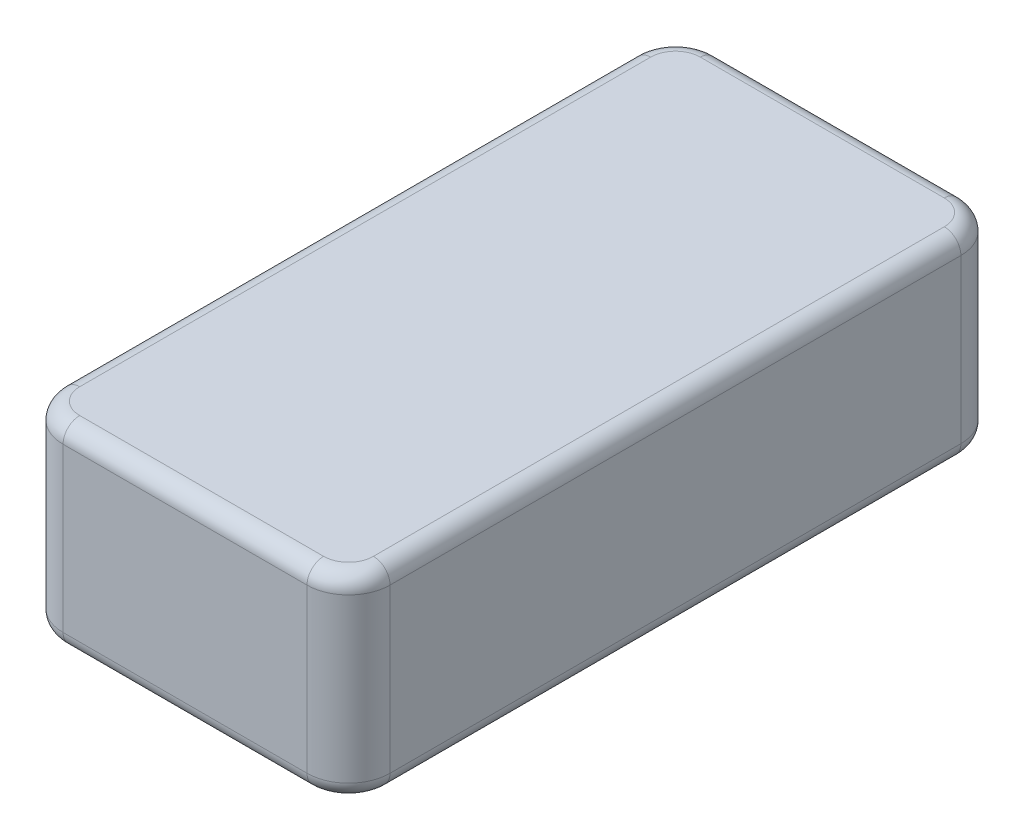
ISO-10303-21;
HEADER;
FILE_DESCRIPTION(('STEP AP214'),'2;1');
FILE_NAME('part.step','',(''),(''),'','','');
FILE_SCHEMA(('AUTOMOTIVE_DESIGN { 1 0 10303 214 1 1 1 1 }'));
ENDSEC;
DATA;
#1=APPLICATION_CONTEXT('core data for automotive mechanical design processes');
#2=APPLICATION_PROTOCOL_DEFINITION('international standard','automotive_design',2000,#1);
#3=PRODUCT_CONTEXT('',#1,'mechanical');
#4=PRODUCT('Part','Part','',(#3));
#5=PRODUCT_RELATED_PRODUCT_CATEGORY('part','',(#4));
#6=PRODUCT_DEFINITION_FORMATION('','',#4);
#7=PRODUCT_DEFINITION_CONTEXT('part definition',#1,'design');
#8=PRODUCT_DEFINITION('design','',#6,#7);
#9=PRODUCT_DEFINITION_SHAPE('','',#8);
#10=(LENGTH_UNIT() NAMED_UNIT(*) SI_UNIT(.MILLI.,.METRE.));
#11=(NAMED_UNIT(*) PLANE_ANGLE_UNIT() SI_UNIT($,.RADIAN.));
#12=(NAMED_UNIT(*) SI_UNIT($,.STERADIAN.) SOLID_ANGLE_UNIT());
#13=UNCERTAINTY_MEASURE_WITH_UNIT(LENGTH_MEASURE(1.E-05),#10,'distance_accuracy_value','');
#14=(GEOMETRIC_REPRESENTATION_CONTEXT(3) GLOBAL_UNCERTAINTY_ASSIGNED_CONTEXT((#13)) GLOBAL_UNIT_ASSIGNED_CONTEXT((#10,
#11,#12)) REPRESENTATION_CONTEXT('',''));
#15=CARTESIAN_POINT('',(0.,0.,0.));
#16=DIRECTION('',(0.,0.,1.));
#17=DIRECTION('',(1.,0.,0.));
#18=AXIS2_PLACEMENT_3D('',#15,#16,#17);
#19=CARTESIAN_POINT('',(0.,3.,0.));
#20=DIRECTION('',(1.,0.,0.));
#21=DIRECTION('',(0.,0.,-1.));
#22=AXIS2_PLACEMENT_3D('',#19,#20,#21);
#23=PLANE('',#22);
#24=DIRECTION('',(0.,-1.,0.));
#25=VECTOR('',#24,1.);
#26=CARTESIAN_POINT('',(0.,3.,-9.365));
#27=LINE('',#26,#25);
#28=CARTESIAN_POINT('',(0.,2.746,-9.365));
#29=VERTEX_POINT('',#28);
#30=CARTESIAN_POINT('',(0.,0.254,-9.365));
#31=VERTEX_POINT('',#30);
#32=EDGE_CURVE('E336',#29,#31,#27,.T.);
#33=ORIENTED_EDGE('',*,*,#32,.T.);
#34=DIRECTION('',(0.,0.,1.));
#35=VECTOR('',#34,1.);
#36=CARTESIAN_POINT('',(0.,0.254,-0.635));
#37=LINE('',#36,#35);
#38=CARTESIAN_POINT('',(0.,0.254,-0.635));
#39=VERTEX_POINT('',#38);
#40=EDGE_CURVE('E239',#31,#39,#37,.T.);
#41=ORIENTED_EDGE('',*,*,#40,.T.);
#42=DIRECTION('',(0.,-1.,0.));
#43=VECTOR('',#42,1.);
#44=CARTESIAN_POINT('',(0.,3.,-0.635));
#45=LINE('',#44,#43);
#46=CARTESIAN_POINT('',(0.,2.746,-0.635));
#47=VERTEX_POINT('',#46);
#48=EDGE_CURVE('E285',#39,#47,#45,.F.);
#49=ORIENTED_EDGE('',*,*,#48,.T.);
#50=DIRECTION('',(0.,0.,1.));
#51=VECTOR('',#50,1.);
#52=CARTESIAN_POINT('',(0.,2.746,0.));
#53=LINE('',#52,#51);
#54=EDGE_CURVE('E236',#47,#29,#53,.F.);
#55=ORIENTED_EDGE('',*,*,#54,.T.);
#56=EDGE_LOOP('',(#33,#41,#49,#55));
#57=FACE_BOUND('',#56,.T.);
#58=ADVANCED_FACE('F45',(#57),#23,.F.);
#59=CARTESIAN_POINT('',(0.,3.,0.));
#60=DIRECTION('',(0.,0.,-1.));
#61=DIRECTION('',(-1.,0.,0.));
#62=AXIS2_PLACEMENT_3D('',#59,#60,#61);
#63=PLANE('',#62);
#64=DIRECTION('',(0.,-1.,0.));
#65=VECTOR('',#64,1.);
#66=CARTESIAN_POINT('',(0.635,3.,0.));
#67=LINE('',#66,#65);
#68=CARTESIAN_POINT('',(0.635,2.746,0.));
#69=VERTEX_POINT('',#68);
#70=CARTESIAN_POINT('',(0.635,0.254,0.));
#71=VERTEX_POINT('',#70);
#72=EDGE_CURVE('E331',#69,#71,#67,.T.);
#73=ORIENTED_EDGE('',*,*,#72,.T.);
#74=DIRECTION('',(1.,0.,0.));
#75=VECTOR('',#74,1.);
#76=CARTESIAN_POINT('',(4.365,0.254,0.));
#77=LINE('',#76,#75);
#78=CARTESIAN_POINT('',(4.365,0.254,0.));
#79=VERTEX_POINT('',#78);
#80=EDGE_CURVE('E202',#71,#79,#77,.T.);
#81=ORIENTED_EDGE('',*,*,#80,.T.);
#82=DIRECTION('',(0.,-1.,0.));
#83=VECTOR('',#82,1.);
#84=CARTESIAN_POINT('',(4.365,3.,0.));
#85=LINE('',#84,#83);
#86=CARTESIAN_POINT('',(4.365,2.746,0.));
#87=VERTEX_POINT('',#86);
#88=EDGE_CURVE('E181',#79,#87,#85,.F.);
#89=ORIENTED_EDGE('',*,*,#88,.T.);
#90=DIRECTION('',(1.,0.,0.));
#91=VECTOR('',#90,1.);
#92=CARTESIAN_POINT('',(0.,2.746,0.));
#93=LINE('',#92,#91);
#94=EDGE_CURVE('E199',#87,#69,#93,.F.);
#95=ORIENTED_EDGE('',*,*,#94,.T.);
#96=EDGE_LOOP('',(#73,#81,#89,#95));
#97=FACE_BOUND('',#96,.T.);
#98=ADVANCED_FACE('F385',(#97),#63,.F.);
#99=CARTESIAN_POINT('',(5.,3.,0.));
#100=DIRECTION('',(-1.,0.,0.));
#101=DIRECTION('',(0.,0.,1.));
#102=AXIS2_PLACEMENT_3D('',#99,#100,#101);
#103=PLANE('',#102);
#104=DIRECTION('',(0.,-1.,0.));
#105=VECTOR('',#104,1.);
#106=CARTESIAN_POINT('',(5.,3.,-0.635));
#107=LINE('',#106,#105);
#108=CARTESIAN_POINT('',(5.,2.746,-0.635));
#109=VERTEX_POINT('',#108);
#110=CARTESIAN_POINT('',(5.,0.254,-0.635));
#111=VERTEX_POINT('',#110);
#112=EDGE_CURVE('E349',#109,#111,#107,.T.);
#113=ORIENTED_EDGE('',*,*,#112,.T.);
#114=DIRECTION('',(0.,0.,-1.));
#115=VECTOR('',#114,1.);
#116=CARTESIAN_POINT('',(5.,0.254,-9.365));
#117=LINE('',#116,#115);
#118=CARTESIAN_POINT('',(5.,0.254,-9.365));
#119=VERTEX_POINT('',#118);
#120=EDGE_CURVE('E214',#111,#119,#117,.T.);
#121=ORIENTED_EDGE('',*,*,#120,.T.);
#122=DIRECTION('',(0.,-1.,0.));
#123=VECTOR('',#122,1.);
#124=CARTESIAN_POINT('',(5.,3.,-9.365));
#125=LINE('',#124,#123);
#126=CARTESIAN_POINT('',(5.,2.746,-9.365));
#127=VERTEX_POINT('',#126);
#128=EDGE_CURVE('E353',#119,#127,#125,.F.);
#129=ORIENTED_EDGE('',*,*,#128,.T.);
#130=DIRECTION('',(0.,0.,-1.));
#131=VECTOR('',#130,1.);
#132=CARTESIAN_POINT('',(5.,2.746,0.));
#133=LINE('',#132,#131);
#134=EDGE_CURVE('E211',#127,#109,#133,.F.);
#135=ORIENTED_EDGE('',*,*,#134,.T.);
#136=EDGE_LOOP('',(#113,#121,#129,#135));
#137=FACE_BOUND('',#136,.T.);
#138=ADVANCED_FACE('F429',(#137),#103,.F.);
#139=CARTESIAN_POINT('',(0.,3.,-10.));
#140=DIRECTION('',(0.,0.,1.));
#141=DIRECTION('',(1.,0.,0.));
#142=AXIS2_PLACEMENT_3D('',#139,#140,#141);
#143=PLANE('',#142);
#144=DIRECTION('',(0.,-1.,0.));
#145=VECTOR('',#144,1.);
#146=CARTESIAN_POINT('',(4.365,3.,-10.));
#147=LINE('',#146,#145);
#148=CARTESIAN_POINT('',(4.365,2.746,-10.));
#149=VERTEX_POINT('',#148);
#150=CARTESIAN_POINT('',(4.365,0.254,-10.));
#151=VERTEX_POINT('',#150);
#152=EDGE_CURVE('E339',#149,#151,#147,.T.);
#153=ORIENTED_EDGE('',*,*,#152,.T.);
#154=DIRECTION('',(-1.,0.,0.));
#155=VECTOR('',#154,1.);
#156=CARTESIAN_POINT('',(0.635,0.254,-10.));
#157=LINE('',#156,#155);
#158=CARTESIAN_POINT('',(0.635,0.254,-10.));
#159=VERTEX_POINT('',#158);
#160=EDGE_CURVE('E227',#151,#159,#157,.T.);
#161=ORIENTED_EDGE('',*,*,#160,.T.);
#162=DIRECTION('',(0.,-1.,0.));
#163=VECTOR('',#162,1.);
#164=CARTESIAN_POINT('',(0.635,3.,-10.));
#165=LINE('',#164,#163);
#166=CARTESIAN_POINT('',(0.635,2.746,-10.));
#167=VERTEX_POINT('',#166);
#168=EDGE_CURVE('E345',#159,#167,#165,.F.);
#169=ORIENTED_EDGE('',*,*,#168,.T.);
#170=DIRECTION('',(-1.,0.,0.));
#171=VECTOR('',#170,1.);
#172=CARTESIAN_POINT('',(0.,2.746,-10.));
#173=LINE('',#172,#171);
#174=EDGE_CURVE('E224',#167,#149,#173,.F.);
#175=ORIENTED_EDGE('',*,*,#174,.T.);
#176=EDGE_LOOP('',(#153,#161,#169,#175));
#177=FACE_BOUND('',#176,.T.);
#178=ADVANCED_FACE('F413',(#177),#143,.F.);
#179=CARTESIAN_POINT('',(0.,3.,0.));
#180=DIRECTION('',(0.,-1.,0.));
#181=DIRECTION('',(0.,0.,-1.));
#182=AXIS2_PLACEMENT_3D('',#179,#180,#181);
#183=PLANE('',#182);
#184=DIRECTION('',(0.,0.,-1.));
#185=VECTOR('',#184,1.);
#186=CARTESIAN_POINT('',(4.746,3.,0.));
#187=LINE('',#186,#185);
#188=CARTESIAN_POINT('',(4.746,3.,-0.635));
#189=VERTEX_POINT('',#188);
#190=CARTESIAN_POINT('',(4.746,3.,-9.365));
#191=VERTEX_POINT('',#190);
#192=EDGE_CURVE('E55',#189,#191,#187,.T.);
#193=ORIENTED_EDGE('',*,*,#192,.T.);
#194=CARTESIAN_POINT('',(4.365,3.,-9.365));
#195=DIRECTION('',(0.,-1.,0.));
#196=DIRECTION('',(0.,0.,-1.));
#197=AXIS2_PLACEMENT_3D('',#194,#195,#196);
#198=CIRCLE('',#197,0.381);
#199=CARTESIAN_POINT('',(4.365,3.,-9.746));
#200=VERTEX_POINT('',#199);
#201=EDGE_CURVE('E11',#191,#200,#198,.F.);
#202=ORIENTED_EDGE('',*,*,#201,.T.);
#203=DIRECTION('',(-1.,0.,0.));
#204=VECTOR('',#203,1.);
#205=CARTESIAN_POINT('',(0.,3.,-9.746));
#206=LINE('',#205,#204);
#207=CARTESIAN_POINT('',(0.635,3.,-9.746));
#208=VERTEX_POINT('',#207);
#209=EDGE_CURVE('E242',#200,#208,#206,.T.);
#210=ORIENTED_EDGE('',*,*,#209,.T.);
#211=CARTESIAN_POINT('',(0.635,3.,-9.365));
#212=DIRECTION('',(0.,-1.,0.));
#213=DIRECTION('',(0.,0.,-1.));
#214=AXIS2_PLACEMENT_3D('',#211,#212,#213);
#215=CIRCLE('',#214,0.381);
#216=CARTESIAN_POINT('',(0.254,3.,-9.365));
#217=VERTEX_POINT('',#216);
#218=EDGE_CURVE('E245',#208,#217,#215,.F.);
#219=ORIENTED_EDGE('',*,*,#218,.T.);
#220=DIRECTION('',(0.,0.,1.));
#221=VECTOR('',#220,1.);
#222=CARTESIAN_POINT('',(0.254,3.,0.));
#223=LINE('',#222,#221);
#224=CARTESIAN_POINT('',(0.254,3.,-0.635));
#225=VERTEX_POINT('',#224);
#226=EDGE_CURVE('E248',#217,#225,#223,.T.);
#227=ORIENTED_EDGE('',*,*,#226,.T.);
#228=CARTESIAN_POINT('',(0.635,3.,-0.635));
#229=DIRECTION('',(0.,-1.,0.));
#230=DIRECTION('',(0.,0.,-1.));
#231=AXIS2_PLACEMENT_3D('',#228,#229,#230);
#232=CIRCLE('',#231,0.381);
#233=CARTESIAN_POINT('',(0.635,3.,-0.254));
#234=VERTEX_POINT('',#233);
#235=EDGE_CURVE('E251',#225,#234,#232,.F.);
#236=ORIENTED_EDGE('',*,*,#235,.T.);
#237=DIRECTION('',(1.,0.,0.));
#238=VECTOR('',#237,1.);
#239=CARTESIAN_POINT('',(0.,3.,-0.254));
#240=LINE('',#239,#238);
#241=CARTESIAN_POINT('',(4.365,3.,-0.254));
#242=VERTEX_POINT('',#241);
#243=EDGE_CURVE('E254',#234,#242,#240,.T.);
#244=ORIENTED_EDGE('',*,*,#243,.T.);
#245=CARTESIAN_POINT('',(4.365,3.,-0.635));
#246=DIRECTION('',(0.,-1.,0.));
#247=DIRECTION('',(0.,0.,-1.));
#248=AXIS2_PLACEMENT_3D('',#245,#246,#247);
#249=CIRCLE('',#248,0.381);
#250=EDGE_CURVE('E66',#242,#189,#249,.F.);
#251=ORIENTED_EDGE('',*,*,#250,.T.);
#252=EDGE_LOOP('',(#193,#202,#210,#219,#227,#236,#244,#251));
#253=FACE_BOUND('',#252,.T.);
#254=ADVANCED_FACE('F401',(#253),#183,.F.);
#255=CARTESIAN_POINT('',(0.,0.,0.));
#256=DIRECTION('',(0.,-1.,0.));
#257=DIRECTION('',(0.,0.,-1.));
#258=AXIS2_PLACEMENT_3D('',#255,#256,#257);
#259=PLANE('',#258);
#260=DIRECTION('',(1.,0.,0.));
#261=VECTOR('',#260,1.);
#262=CARTESIAN_POINT('',(0.635,0.,-0.254));
#263=LINE('',#262,#261);
#264=CARTESIAN_POINT('',(4.365,0.,-0.254));
#265=VERTEX_POINT('',#264);
#266=CARTESIAN_POINT('',(0.635,0.,-0.254));
#267=VERTEX_POINT('',#266);
#268=EDGE_CURVE('E185',#265,#267,#263,.F.);
#269=ORIENTED_EDGE('',*,*,#268,.T.);
#270=CARTESIAN_POINT('',(0.635,0.,-0.635));
#271=DIRECTION('',(0.,-1.,0.));
#272=DIRECTION('',(0.,0.,-1.));
#273=AXIS2_PLACEMENT_3D('',#270,#271,#272);
#274=CIRCLE('',#273,0.381);
#275=CARTESIAN_POINT('',(0.254,0.,-0.635));
#276=VERTEX_POINT('',#275);
#277=EDGE_CURVE('E164',#267,#276,#274,.T.);
#278=ORIENTED_EDGE('',*,*,#277,.T.);
#279=DIRECTION('',(0.,0.,1.));
#280=VECTOR('',#279,1.);
#281=CARTESIAN_POINT('',(0.254,0.,-9.365));
#282=LINE('',#281,#280);
#283=CARTESIAN_POINT('',(0.254,0.,-9.365));
#284=VERTEX_POINT('',#283);
#285=EDGE_CURVE('E173',#276,#284,#282,.F.);
#286=ORIENTED_EDGE('',*,*,#285,.T.);
#287=CARTESIAN_POINT('',(0.635,0.,-9.365));
#288=DIRECTION('',(0.,-1.,0.));
#289=DIRECTION('',(0.,0.,-1.));
#290=AXIS2_PLACEMENT_3D('',#287,#288,#289);
#291=CIRCLE('',#290,0.381);
#292=CARTESIAN_POINT('',(0.635,0.,-9.746));
#293=VERTEX_POINT('',#292);
#294=EDGE_CURVE('E180',#284,#293,#291,.T.);
#295=ORIENTED_EDGE('',*,*,#294,.T.);
#296=DIRECTION('',(-1.,0.,0.));
#297=VECTOR('',#296,1.);
#298=CARTESIAN_POINT('',(4.365,0.,-9.746));
#299=LINE('',#298,#297);
#300=CARTESIAN_POINT('',(4.365,0.,-9.746));
#301=VERTEX_POINT('',#300);
#302=EDGE_CURVE('E364',#293,#301,#299,.F.);
#303=ORIENTED_EDGE('',*,*,#302,.T.);
#304=CARTESIAN_POINT('',(4.365,0.,-9.365));
#305=DIRECTION('',(0.,-1.,0.));
#306=DIRECTION('',(0.,0.,-1.));
#307=AXIS2_PLACEMENT_3D('',#304,#305,#306);
#308=CIRCLE('',#307,0.381);
#309=CARTESIAN_POINT('',(4.746,0.,-9.365));
#310=VERTEX_POINT('',#309);
#311=EDGE_CURVE('E367',#301,#310,#308,.T.);
#312=ORIENTED_EDGE('',*,*,#311,.T.);
#313=DIRECTION('',(0.,0.,-1.));
#314=VECTOR('',#313,1.);
#315=CARTESIAN_POINT('',(4.746,0.,-0.635));
#316=LINE('',#315,#314);
#317=CARTESIAN_POINT('',(4.746,0.,-0.635));
#318=VERTEX_POINT('',#317);
#319=EDGE_CURVE('E370',#310,#318,#316,.F.);
#320=ORIENTED_EDGE('',*,*,#319,.T.);
#321=CARTESIAN_POINT('',(4.365,0.,-0.635));
#322=DIRECTION('',(0.,-1.,0.));
#323=DIRECTION('',(0.,0.,-1.));
#324=AXIS2_PLACEMENT_3D('',#321,#322,#323);
#325=CIRCLE('',#324,0.381);
#326=EDGE_CURVE('E193',#318,#265,#325,.T.);
#327=ORIENTED_EDGE('',*,*,#326,.T.);
#328=EDGE_LOOP('',(#269,#278,#286,#295,#303,#312,#320,#327));
#329=FACE_BOUND('',#328,.T.);
#330=ADVANCED_FACE('F183',(#329),#259,.T.);
#331=CARTESIAN_POINT('',(0.635,3.,-9.365));
#332=DIRECTION('',(0.,-1.,0.));
#333=DIRECTION('',(0.,0.,-1.));
#334=AXIS2_PLACEMENT_3D('',#331,#332,#333);
#335=CYLINDRICAL_SURFACE('',#334,0.635);
#336=ORIENTED_EDGE('',*,*,#168,.F.);
#337=CARTESIAN_POINT('',(0.635,0.254,-9.365));
#338=DIRECTION('',(0.,-1.,0.));
#339=DIRECTION('',(0.,0.,-1.));
#340=AXIS2_PLACEMENT_3D('',#337,#338,#339);
#341=CIRCLE('',#340,0.635);
#342=EDGE_CURVE('E233',#159,#31,#341,.F.);
#343=ORIENTED_EDGE('',*,*,#342,.T.);
#344=ORIENTED_EDGE('',*,*,#32,.F.);
#345=CARTESIAN_POINT('',(0.635,2.746,-9.365));
#346=DIRECTION('',(0.,-1.,0.));
#347=DIRECTION('',(0.,0.,-1.));
#348=AXIS2_PLACEMENT_3D('',#345,#346,#347);
#349=CIRCLE('',#348,0.635);
#350=EDGE_CURVE('E230',#29,#167,#349,.T.);
#351=ORIENTED_EDGE('',*,*,#350,.T.);
#352=EDGE_LOOP('',(#336,#343,#344,#351));
#353=FACE_BOUND('',#352,.T.);
#354=ADVANCED_FACE('F443',(#353),#335,.T.);
#355=CARTESIAN_POINT('',(4.365,3.,-9.365));
#356=DIRECTION('',(0.,-1.,0.));
#357=DIRECTION('',(0.,0.,-1.));
#358=AXIS2_PLACEMENT_3D('',#355,#356,#357);
#359=CYLINDRICAL_SURFACE('',#358,0.635);
#360=ORIENTED_EDGE('',*,*,#128,.F.);
#361=CARTESIAN_POINT('',(4.365,0.254,-9.365));
#362=DIRECTION('',(0.,-1.,0.));
#363=DIRECTION('',(0.,0.,-1.));
#364=AXIS2_PLACEMENT_3D('',#361,#362,#363);
#365=CIRCLE('',#364,0.635);
#366=EDGE_CURVE('E221',#119,#151,#365,.F.);
#367=ORIENTED_EDGE('',*,*,#366,.T.);
#368=ORIENTED_EDGE('',*,*,#152,.F.);
#369=CARTESIAN_POINT('',(4.365,2.746,-9.365));
#370=DIRECTION('',(0.,-1.,0.));
#371=DIRECTION('',(0.,0.,-1.));
#372=AXIS2_PLACEMENT_3D('',#369,#370,#371);
#373=CIRCLE('',#372,0.635);
#374=EDGE_CURVE('E217',#149,#127,#373,.T.);
#375=ORIENTED_EDGE('',*,*,#374,.T.);
#376=EDGE_LOOP('',(#360,#367,#368,#375));
#377=FACE_BOUND('',#376,.T.);
#378=ADVANCED_FACE('F418',(#377),#359,.T.);
#379=CARTESIAN_POINT('',(4.365,3.,-0.635));
#380=DIRECTION('',(0.,-1.,0.));
#381=DIRECTION('',(0.,0.,-1.));
#382=AXIS2_PLACEMENT_3D('',#379,#380,#381);
#383=CYLINDRICAL_SURFACE('',#382,0.635);
#384=ORIENTED_EDGE('',*,*,#88,.F.);
#385=CARTESIAN_POINT('',(4.365,0.254,-0.635));
#386=DIRECTION('',(0.,-1.,0.));
#387=DIRECTION('',(0.,0.,-1.));
#388=AXIS2_PLACEMENT_3D('',#385,#386,#387);
#389=CIRCLE('',#388,0.635);
#390=EDGE_CURVE('E208',#79,#111,#389,.F.);
#391=ORIENTED_EDGE('',*,*,#390,.T.);
#392=ORIENTED_EDGE('',*,*,#112,.F.);
#393=CARTESIAN_POINT('',(4.365,2.746,-0.635));
#394=DIRECTION('',(0.,-1.,0.));
#395=DIRECTION('',(0.,0.,-1.));
#396=AXIS2_PLACEMENT_3D('',#393,#394,#395);
#397=CIRCLE('',#396,0.635);
#398=EDGE_CURVE('E205',#109,#87,#397,.T.);
#399=ORIENTED_EDGE('',*,*,#398,.T.);
#400=EDGE_LOOP('',(#384,#391,#392,#399));
#401=FACE_BOUND('',#400,.T.);
#402=ADVANCED_FACE('F387',(#401),#383,.T.);
#403=CARTESIAN_POINT('',(0.635,3.,-0.635));
#404=DIRECTION('',(0.,-1.,0.));
#405=DIRECTION('',(0.,0.,-1.));
#406=AXIS2_PLACEMENT_3D('',#403,#404,#405);
#407=CYLINDRICAL_SURFACE('',#406,0.635);
#408=ORIENTED_EDGE('',*,*,#48,.F.);
#409=CARTESIAN_POINT('',(0.635,0.254,-0.635));
#410=DIRECTION('',(0.,-1.,0.));
#411=DIRECTION('',(0.,0.,-1.));
#412=AXIS2_PLACEMENT_3D('',#409,#410,#411);
#413=CIRCLE('',#412,0.635);
#414=EDGE_CURVE('E166',#39,#71,#413,.F.);
#415=ORIENTED_EDGE('',*,*,#414,.T.);
#416=ORIENTED_EDGE('',*,*,#72,.F.);
#417=CARTESIAN_POINT('',(0.635,2.746,-0.635));
#418=DIRECTION('',(0.,-1.,0.));
#419=DIRECTION('',(0.,0.,-1.));
#420=AXIS2_PLACEMENT_3D('',#417,#418,#419);
#421=CIRCLE('',#420,0.635);
#422=EDGE_CURVE('E188',#69,#47,#421,.T.);
#423=ORIENTED_EDGE('',*,*,#422,.T.);
#424=EDGE_LOOP('',(#408,#415,#416,#423));
#425=FACE_BOUND('',#424,.T.);
#426=ADVANCED_FACE('F329',(#425),#407,.T.);
#427=CARTESIAN_POINT('',(4.365,0.254,-9.365));
#428=DIRECTION('',(0.,-1.,0.));
#429=DIRECTION('',(0.,0.,-1.));
#430=AXIS2_PLACEMENT_3D('',#427,#428,#429);
#431=TOROIDAL_SURFACE('',#430,0.381,0.254);
#432=CARTESIAN_POINT('',(4.365,0.254,-9.746));
#433=DIRECTION('',(-1.,0.,0.));
#434=DIRECTION('',(0.,0.,1.));
#435=AXIS2_PLACEMENT_3D('',#432,#433,#434);
#436=CIRCLE('',#435,0.254);
#437=EDGE_CURVE('E277',#151,#301,#436,.T.);
#438=ORIENTED_EDGE('',*,*,#437,.F.);
#439=ORIENTED_EDGE('',*,*,#366,.F.);
#440=CARTESIAN_POINT('',(4.746,0.254,-9.365));
#441=DIRECTION('',(0.,0.,1.));
#442=DIRECTION('',(1.,0.,0.));
#443=AXIS2_PLACEMENT_3D('',#440,#441,#442);
#444=CIRCLE('',#443,0.254);
#445=EDGE_CURVE('E281',#310,#119,#444,.T.);
#446=ORIENTED_EDGE('',*,*,#445,.F.);
#447=ORIENTED_EDGE('',*,*,#311,.F.);
#448=EDGE_LOOP('',(#438,#439,#446,#447));
#449=FACE_BOUND('',#448,.T.);
#450=ADVANCED_FACE('F422',(#449),#431,.T.);
#451=CARTESIAN_POINT('',(4.746,0.254,0.));
#452=DIRECTION('',(0.,0.,1.));
#453=DIRECTION('',(1.,0.,0.));
#454=AXIS2_PLACEMENT_3D('',#451,#452,#453);
#455=CYLINDRICAL_SURFACE('',#454,0.254);
#456=ORIENTED_EDGE('',*,*,#445,.T.);
#457=ORIENTED_EDGE('',*,*,#120,.F.);
#458=CARTESIAN_POINT('',(4.746,0.254,-0.635));
#459=DIRECTION('',(0.,0.,1.));
#460=DIRECTION('',(1.,0.,0.));
#461=AXIS2_PLACEMENT_3D('',#458,#459,#460);
#462=CIRCLE('',#461,0.254);
#463=EDGE_CURVE('E273',#318,#111,#462,.T.);
#464=ORIENTED_EDGE('',*,*,#463,.F.);
#465=ORIENTED_EDGE('',*,*,#319,.F.);
#466=EDGE_LOOP('',(#456,#457,#464,#465));
#467=FACE_BOUND('',#466,.T.);
#468=ADVANCED_FACE('F427',(#467),#455,.T.);
#469=CARTESIAN_POINT('',(0.,0.254,-9.746));
#470=DIRECTION('',(1.,0.,0.));
#471=DIRECTION('',(0.,0.,-1.));
#472=AXIS2_PLACEMENT_3D('',#469,#470,#471);
#473=CYLINDRICAL_SURFACE('',#472,0.254);
#474=ORIENTED_EDGE('',*,*,#437,.T.);
#475=ORIENTED_EDGE('',*,*,#302,.F.);
#476=CARTESIAN_POINT('',(0.635,0.254,-9.746));
#477=DIRECTION('',(-1.,0.,0.));
#478=DIRECTION('',(0.,0.,1.));
#479=AXIS2_PLACEMENT_3D('',#476,#477,#478);
#480=CIRCLE('',#479,0.254);
#481=EDGE_CURVE('E269',#159,#293,#480,.T.);
#482=ORIENTED_EDGE('',*,*,#481,.F.);
#483=ORIENTED_EDGE('',*,*,#160,.F.);
#484=EDGE_LOOP('',(#474,#475,#482,#483));
#485=FACE_BOUND('',#484,.T.);
#486=ADVANCED_FACE('F465',(#485),#473,.T.);
#487=CARTESIAN_POINT('',(4.365,0.254,-0.635));
#488=DIRECTION('',(0.,-1.,0.));
#489=DIRECTION('',(0.,0.,-1.));
#490=AXIS2_PLACEMENT_3D('',#487,#488,#489);
#491=TOROIDAL_SURFACE('',#490,0.381,0.254);
#492=ORIENTED_EDGE('',*,*,#463,.T.);
#493=ORIENTED_EDGE('',*,*,#390,.F.);
#494=CARTESIAN_POINT('',(4.365,0.254,-0.254));
#495=DIRECTION('',(-1.,0.,0.));
#496=DIRECTION('',(0.,0.,1.));
#497=AXIS2_PLACEMENT_3D('',#494,#495,#496);
#498=CIRCLE('',#497,0.254);
#499=EDGE_CURVE('E265',#265,#79,#498,.T.);
#500=ORIENTED_EDGE('',*,*,#499,.F.);
#501=ORIENTED_EDGE('',*,*,#326,.F.);
#502=EDGE_LOOP('',(#492,#493,#500,#501));
#503=FACE_BOUND('',#502,.T.);
#504=ADVANCED_FACE('F379',(#503),#491,.T.);
#505=CARTESIAN_POINT('',(0.635,0.254,-9.365));
#506=DIRECTION('',(0.,-1.,0.));
#507=DIRECTION('',(0.,0.,-1.));
#508=AXIS2_PLACEMENT_3D('',#505,#506,#507);
#509=TOROIDAL_SURFACE('',#508,0.381,0.254);
#510=ORIENTED_EDGE('',*,*,#481,.T.);
#511=ORIENTED_EDGE('',*,*,#294,.F.);
#512=CARTESIAN_POINT('',(0.254,0.254,-9.365));
#513=DIRECTION('',(0.,0.,1.));
#514=DIRECTION('',(1.,0.,0.));
#515=AXIS2_PLACEMENT_3D('',#512,#513,#514);
#516=CIRCLE('',#515,0.254);
#517=EDGE_CURVE('E176',#31,#284,#516,.T.);
#518=ORIENTED_EDGE('',*,*,#517,.F.);
#519=ORIENTED_EDGE('',*,*,#342,.F.);
#520=EDGE_LOOP('',(#510,#511,#518,#519));
#521=FACE_BOUND('',#520,.T.);
#522=ADVANCED_FACE('F459',(#521),#509,.T.);
#523=CARTESIAN_POINT('',(0.,0.254,-0.254));
#524=DIRECTION('',(-1.,0.,0.));
#525=DIRECTION('',(0.,0.,1.));
#526=AXIS2_PLACEMENT_3D('',#523,#524,#525);
#527=CYLINDRICAL_SURFACE('',#526,0.254);
#528=ORIENTED_EDGE('',*,*,#499,.T.);
#529=ORIENTED_EDGE('',*,*,#80,.F.);
#530=CARTESIAN_POINT('',(0.635,0.254,-0.254));
#531=DIRECTION('',(-1.,0.,0.));
#532=DIRECTION('',(0.,0.,1.));
#533=AXIS2_PLACEMENT_3D('',#530,#531,#532);
#534=CIRCLE('',#533,0.254);
#535=EDGE_CURVE('E170',#267,#71,#534,.T.);
#536=ORIENTED_EDGE('',*,*,#535,.F.);
#537=ORIENTED_EDGE('',*,*,#268,.F.);
#538=EDGE_LOOP('',(#528,#529,#536,#537));
#539=FACE_BOUND('',#538,.T.);
#540=ADVANCED_FACE('F382',(#539),#527,.T.);
#541=CARTESIAN_POINT('',(0.254,0.254,0.));
#542=DIRECTION('',(0.,0.,-1.));
#543=DIRECTION('',(-1.,0.,0.));
#544=AXIS2_PLACEMENT_3D('',#541,#542,#543);
#545=CYLINDRICAL_SURFACE('',#544,0.254);
#546=ORIENTED_EDGE('',*,*,#517,.T.);
#547=ORIENTED_EDGE('',*,*,#285,.F.);
#548=CARTESIAN_POINT('',(0.254,0.254,-0.635));
#549=DIRECTION('',(0.,0.,1.));
#550=DIRECTION('',(1.,0.,0.));
#551=AXIS2_PLACEMENT_3D('',#548,#549,#550);
#552=CIRCLE('',#551,0.254);
#553=EDGE_CURVE('E160',#39,#276,#552,.T.);
#554=ORIENTED_EDGE('',*,*,#553,.F.);
#555=ORIENTED_EDGE('',*,*,#40,.F.);
#556=EDGE_LOOP('',(#546,#547,#554,#555));
#557=FACE_BOUND('',#556,.T.);
#558=ADVANCED_FACE('F174',(#557),#545,.T.);
#559=CARTESIAN_POINT('',(0.635,0.254,-0.635));
#560=DIRECTION('',(0.,-1.,0.));
#561=DIRECTION('',(0.,0.,-1.));
#562=AXIS2_PLACEMENT_3D('',#559,#560,#561);
#563=TOROIDAL_SURFACE('',#562,0.381,0.254);
#564=ORIENTED_EDGE('',*,*,#535,.T.);
#565=ORIENTED_EDGE('',*,*,#414,.F.);
#566=ORIENTED_EDGE('',*,*,#553,.T.);
#567=ORIENTED_EDGE('',*,*,#277,.F.);
#568=EDGE_LOOP('',(#564,#565,#566,#567));
#569=FACE_BOUND('',#568,.T.);
#570=ADVANCED_FACE('F162',(#569),#563,.T.);
#571=CARTESIAN_POINT('',(0.635,2.746,-0.635));
#572=DIRECTION('',(0.,-1.,0.));
#573=DIRECTION('',(0.,0.,-1.));
#574=AXIS2_PLACEMENT_3D('',#571,#572,#573);
#575=TOROIDAL_SURFACE('',#574,0.381,0.254);
#576=CARTESIAN_POINT('',(0.254,2.746,-0.635));
#577=DIRECTION('',(0.,0.,-1.));
#578=DIRECTION('',(-1.,0.,0.));
#579=AXIS2_PLACEMENT_3D('',#576,#577,#578);
#580=CIRCLE('',#579,0.254);
#581=EDGE_CURVE('E307',#47,#225,#580,.T.);
#582=ORIENTED_EDGE('',*,*,#581,.F.);
#583=ORIENTED_EDGE('',*,*,#422,.F.);
#584=CARTESIAN_POINT('',(0.635,2.746,-0.254));
#585=DIRECTION('',(1.,0.,0.));
#586=DIRECTION('',(0.,0.,-1.));
#587=AXIS2_PLACEMENT_3D('',#584,#585,#586);
#588=CIRCLE('',#587,0.254);
#589=EDGE_CURVE('E49',#234,#69,#588,.T.);
#590=ORIENTED_EDGE('',*,*,#589,.F.);
#591=ORIENTED_EDGE('',*,*,#235,.F.);
#592=EDGE_LOOP('',(#582,#583,#590,#591));
#593=FACE_BOUND('',#592,.T.);
#594=ADVANCED_FACE('F47',(#593),#575,.T.);
#595=CARTESIAN_POINT('',(0.,2.746,-0.254));
#596=DIRECTION('',(1.,0.,0.));
#597=DIRECTION('',(0.,0.,-1.));
#598=AXIS2_PLACEMENT_3D('',#595,#596,#597);
#599=CYLINDRICAL_SURFACE('',#598,0.254);
#600=ORIENTED_EDGE('',*,*,#589,.T.);
#601=ORIENTED_EDGE('',*,*,#94,.F.);
#602=CARTESIAN_POINT('',(4.365,2.746,-0.254));
#603=DIRECTION('',(1.,0.,0.));
#604=DIRECTION('',(0.,0.,-1.));
#605=AXIS2_PLACEMENT_3D('',#602,#603,#604);
#606=CIRCLE('',#605,0.254);
#607=EDGE_CURVE('E304',#242,#87,#606,.T.);
#608=ORIENTED_EDGE('',*,*,#607,.F.);
#609=ORIENTED_EDGE('',*,*,#243,.F.);
#610=EDGE_LOOP('',(#600,#601,#608,#609));
#611=FACE_BOUND('',#610,.T.);
#612=ADVANCED_FACE('F320',(#611),#599,.T.);
#613=CARTESIAN_POINT('',(0.254,2.746,0.));
#614=DIRECTION('',(0.,0.,1.));
#615=DIRECTION('',(1.,0.,0.));
#616=AXIS2_PLACEMENT_3D('',#613,#614,#615);
#617=CYLINDRICAL_SURFACE('',#616,0.254);
#618=ORIENTED_EDGE('',*,*,#581,.T.);
#619=ORIENTED_EDGE('',*,*,#226,.F.);
#620=CARTESIAN_POINT('',(0.254,2.746,-9.365));
#621=DIRECTION('',(0.,0.,-1.));
#622=DIRECTION('',(-1.,0.,0.));
#623=AXIS2_PLACEMENT_3D('',#620,#621,#622);
#624=CIRCLE('',#623,0.254);
#625=EDGE_CURVE('E300',#29,#217,#624,.T.);
#626=ORIENTED_EDGE('',*,*,#625,.F.);
#627=ORIENTED_EDGE('',*,*,#54,.F.);
#628=EDGE_LOOP('',(#618,#619,#626,#627));
#629=FACE_BOUND('',#628,.T.);
#630=ADVANCED_FACE('F483',(#629),#617,.T.);
#631=CARTESIAN_POINT('',(4.365,2.746,-0.635));
#632=DIRECTION('',(0.,-1.,0.));
#633=DIRECTION('',(0.,0.,-1.));
#634=AXIS2_PLACEMENT_3D('',#631,#632,#633);
#635=TOROIDAL_SURFACE('',#634,0.381,0.254);
#636=ORIENTED_EDGE('',*,*,#607,.T.);
#637=ORIENTED_EDGE('',*,*,#398,.F.);
#638=CARTESIAN_POINT('',(4.746,2.746,-0.635));
#639=DIRECTION('',(0.,0.,-1.));
#640=DIRECTION('',(-1.,0.,0.));
#641=AXIS2_PLACEMENT_3D('',#638,#639,#640);
#642=CIRCLE('',#641,0.254);
#643=EDGE_CURVE('E296',#189,#109,#642,.T.);
#644=ORIENTED_EDGE('',*,*,#643,.F.);
#645=ORIENTED_EDGE('',*,*,#250,.F.);
#646=EDGE_LOOP('',(#636,#637,#644,#645));
#647=FACE_BOUND('',#646,.T.);
#648=ADVANCED_FACE('F391',(#647),#635,.T.);
#649=CARTESIAN_POINT('',(0.635,2.746,-9.365));
#650=DIRECTION('',(0.,-1.,0.));
#651=DIRECTION('',(0.,0.,-1.));
#652=AXIS2_PLACEMENT_3D('',#649,#650,#651);
#653=TOROIDAL_SURFACE('',#652,0.381,0.254);
#654=ORIENTED_EDGE('',*,*,#625,.T.);
#655=ORIENTED_EDGE('',*,*,#218,.F.);
#656=CARTESIAN_POINT('',(0.635,2.746,-9.746));
#657=DIRECTION('',(1.,0.,0.));
#658=DIRECTION('',(0.,0.,-1.));
#659=AXIS2_PLACEMENT_3D('',#656,#657,#658);
#660=CIRCLE('',#659,0.254);
#661=EDGE_CURVE('E292',#167,#208,#660,.T.);
#662=ORIENTED_EDGE('',*,*,#661,.F.);
#663=ORIENTED_EDGE('',*,*,#350,.F.);
#664=EDGE_LOOP('',(#654,#655,#662,#663));
#665=FACE_BOUND('',#664,.T.);
#666=ADVANCED_FACE('F406',(#665),#653,.T.);
#667=CARTESIAN_POINT('',(4.746,2.746,0.));
#668=DIRECTION('',(0.,0.,-1.));
#669=DIRECTION('',(-1.,0.,0.));
#670=AXIS2_PLACEMENT_3D('',#667,#668,#669);
#671=CYLINDRICAL_SURFACE('',#670,0.254);
#672=ORIENTED_EDGE('',*,*,#643,.T.);
#673=ORIENTED_EDGE('',*,*,#134,.F.);
#674=CARTESIAN_POINT('',(4.746,2.746,-9.365));
#675=DIRECTION('',(0.,0.,-1.));
#676=DIRECTION('',(-1.,0.,0.));
#677=AXIS2_PLACEMENT_3D('',#674,#675,#676);
#678=CIRCLE('',#677,0.254);
#679=EDGE_CURVE('E289',#191,#127,#678,.T.);
#680=ORIENTED_EDGE('',*,*,#679,.F.);
#681=ORIENTED_EDGE('',*,*,#192,.F.);
#682=EDGE_LOOP('',(#672,#673,#680,#681));
#683=FACE_BOUND('',#682,.T.);
#684=ADVANCED_FACE('F394',(#683),#671,.T.);
#685=CARTESIAN_POINT('',(0.,2.746,-9.746));
#686=DIRECTION('',(-1.,0.,0.));
#687=DIRECTION('',(0.,0.,1.));
#688=AXIS2_PLACEMENT_3D('',#685,#686,#687);
#689=CYLINDRICAL_SURFACE('',#688,0.254);
#690=ORIENTED_EDGE('',*,*,#661,.T.);
#691=ORIENTED_EDGE('',*,*,#209,.F.);
#692=CARTESIAN_POINT('',(4.365,2.746,-9.746));
#693=DIRECTION('',(1.,0.,0.));
#694=DIRECTION('',(0.,0.,-1.));
#695=AXIS2_PLACEMENT_3D('',#692,#693,#694);
#696=CIRCLE('',#695,0.254);
#697=EDGE_CURVE('E286',#149,#200,#696,.T.);
#698=ORIENTED_EDGE('',*,*,#697,.F.);
#699=ORIENTED_EDGE('',*,*,#174,.F.);
#700=EDGE_LOOP('',(#690,#691,#698,#699));
#701=FACE_BOUND('',#700,.T.);
#702=ADVANCED_FACE('F410',(#701),#689,.T.);
#703=CARTESIAN_POINT('',(4.365,2.746,-9.365));
#704=DIRECTION('',(0.,-1.,0.));
#705=DIRECTION('',(0.,0.,-1.));
#706=AXIS2_PLACEMENT_3D('',#703,#704,#705);
#707=TOROIDAL_SURFACE('',#706,0.381,0.254);
#708=ORIENTED_EDGE('',*,*,#679,.T.);
#709=ORIENTED_EDGE('',*,*,#374,.F.);
#710=ORIENTED_EDGE('',*,*,#697,.T.);
#711=ORIENTED_EDGE('',*,*,#201,.F.);
#712=EDGE_LOOP('',(#708,#709,#710,#711));
#713=FACE_BOUND('',#712,.T.);
#714=ADVANCED_FACE('F398',(#713),#707,.T.);
#715=CLOSED_SHELL('',(#58,#98,#138,#178,#254,#330,#354,#378,#402,#426,#450,#468,#486,#504,#522,
#540,#558,#570,#594,#612,#630,#648,#666,#684,#702,#714));
#716=MANIFOLD_SOLID_BREP('B2',#715);
#717=ADVANCED_BREP_SHAPE_REPRESENTATION('',(#18,#716),#14);
#718=SHAPE_DEFINITION_REPRESENTATION(#9,#717);
ENDSEC;
END-ISO-10303-21;
